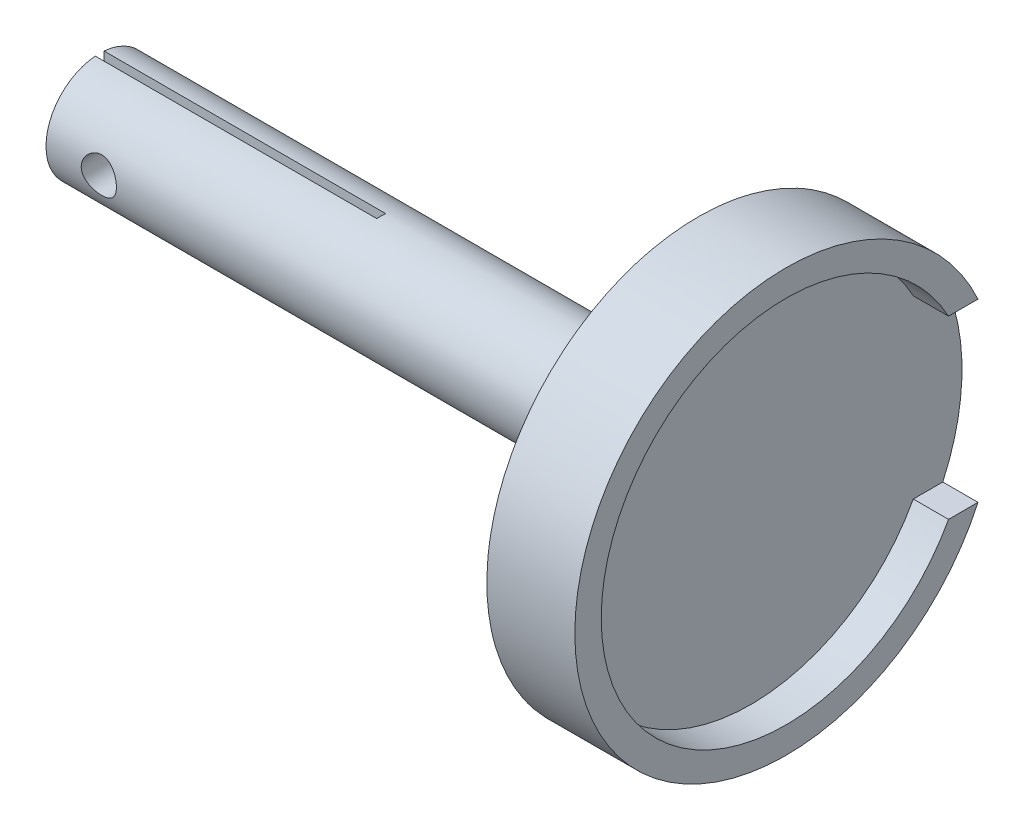
ISO-10303-21;
HEADER;
FILE_DESCRIPTION(('STEP AP214'),'2;1');
FILE_NAME('part.step','',(''),(''),'','','');
FILE_SCHEMA(('AUTOMOTIVE_DESIGN { 1 0 10303 214 1 1 1 1 }'));
ENDSEC;
DATA;
#1=APPLICATION_CONTEXT('core data for automotive mechanical design processes');
#2=APPLICATION_PROTOCOL_DEFINITION('international standard','automotive_design',2000,#1);
#3=PRODUCT_CONTEXT('',#1,'mechanical');
#4=PRODUCT('Part','Part','',(#3));
#5=PRODUCT_RELATED_PRODUCT_CATEGORY('part','',(#4));
#6=PRODUCT_DEFINITION_FORMATION('','',#4);
#7=PRODUCT_DEFINITION_CONTEXT('part definition',#1,'design');
#8=PRODUCT_DEFINITION('design','',#6,#7);
#9=PRODUCT_DEFINITION_SHAPE('','',#8);
#10=(LENGTH_UNIT() NAMED_UNIT(*) SI_UNIT(.MILLI.,.METRE.));
#11=(NAMED_UNIT(*) PLANE_ANGLE_UNIT() SI_UNIT($,.RADIAN.));
#12=(NAMED_UNIT(*) SI_UNIT($,.STERADIAN.) SOLID_ANGLE_UNIT());
#13=UNCERTAINTY_MEASURE_WITH_UNIT(LENGTH_MEASURE(1.E-05),#10,'distance_accuracy_value','');
#14=(GEOMETRIC_REPRESENTATION_CONTEXT(3) GLOBAL_UNCERTAINTY_ASSIGNED_CONTEXT((#13)) GLOBAL_UNIT_ASSIGNED_CONTEXT((#10,
#11,#12)) REPRESENTATION_CONTEXT('',''));
#15=CARTESIAN_POINT('',(0.,0.,0.));
#16=DIRECTION('',(0.,0.,1.));
#17=DIRECTION('',(1.,0.,0.));
#18=AXIS2_PLACEMENT_3D('',#15,#16,#17);
#19=CARTESIAN_POINT('',(34.,0.,0.));
#20=DIRECTION('',(-1.,0.,0.));
#21=DIRECTION('',(0.,0.,1.));
#22=AXIS2_PLACEMENT_3D('',#19,#20,#21);
#23=CYLINDRICAL_SURFACE('',#22,3.05);
#24=CARTESIAN_POINT('',(29.1114930704764,0.,-3.05));
#25=CARTESIAN_POINT('',(29.1114930704764,0.399244066002534,-3.05));
#26=CARTESIAN_POINT('',(29.1114930704764,0.798331047656877,-2.9706166636888));
#27=CARTESIAN_POINT('',(29.1114930704764,1.53603788977017,-2.66504848463005));
#28=CARTESIAN_POINT('',(29.1114930704764,1.87436749619847,-2.43898386903947));
#29=CARTESIAN_POINT('',(29.1114930704764,2.43898386903947,-1.87436749619847));
#30=CARTESIAN_POINT('',(29.1114930704764,2.66504848462992,-1.53603788977048));
#31=CARTESIAN_POINT('',(29.1114930704764,2.97061666368893,-0.798331047656558));
#32=CARTESIAN_POINT('',(29.1114930704764,3.05,-0.399244066002982));
#33=CARTESIAN_POINT('',(29.1114930704764,3.05,0.399244066002982));
#34=CARTESIAN_POINT('',(29.1114930704764,2.97061666368867,0.798331047657195));
#35=CARTESIAN_POINT('',(29.1114930704764,2.66504848463018,1.53603788976986));
#36=CARTESIAN_POINT('',(29.1114930704764,2.43898386903872,1.87436749619921));
#37=CARTESIAN_POINT('',(29.1114930704764,1.87436749619921,2.43898386903873));
#38=CARTESIAN_POINT('',(29.1114930704764,1.53603788977091,2.66504848462974));
#39=CARTESIAN_POINT('',(29.1114930704764,0.79833104765615,2.9706166636891));
#40=CARTESIAN_POINT('',(29.1114930704764,0.399244066002983,3.05));
#41=CARTESIAN_POINT('',(29.1114930704764,-0.399244066002982,3.05));
#42=CARTESIAN_POINT('',(29.1114930704764,-0.798331047656664,2.97061666368889));
#43=CARTESIAN_POINT('',(29.1114930704764,-1.53603788977037,2.66504848462996));
#44=CARTESIAN_POINT('',(29.1114930704764,-1.87436749619921,2.43898386903872));
#45=CARTESIAN_POINT('',(29.1114930704764,-2.43898386903873,1.87436749619921));
#46=CARTESIAN_POINT('',(29.1114930704764,-2.66504848462999,1.53603788977031));
#47=CARTESIAN_POINT('',(29.1114930704764,-2.97061666368886,0.798331047656749));
#48=CARTESIAN_POINT('',(29.1114930704764,-3.05,0.399244066002978));
#49=CARTESIAN_POINT('',(29.1114930704764,-3.05,-0.399244066002987));
#50=CARTESIAN_POINT('',(29.1114930704764,-2.97061666368895,-0.798331047656523));
#51=CARTESIAN_POINT('',(29.1114930704764,-2.66504848462991,-1.53603788977052));
#52=CARTESIAN_POINT('',(29.1114930704764,-2.43898386903814,-1.87436749619979));
#53=CARTESIAN_POINT('',(29.1114930704764,-1.87436749619981,-2.43898386903813));
#54=CARTESIAN_POINT('',(29.1114930704764,-1.53603788977021,-2.66504848463003));
#55=CARTESIAN_POINT('',(29.1114930704764,-0.798331047656848,-2.97061666368881));
#56=CARTESIAN_POINT('',(29.1114930704764,-0.399244066002535,-3.05));
#57=CARTESIAN_POINT('',(29.1114930704764,0.,-3.05));
#58=(BOUNDED_CURVE() B_SPLINE_CURVE(3,(#24,#25,#26,#27,#28,#29,#30,#31,#32,#33,#34,#35,#36,#37,
#38,#39,#40,#41,#42,#43,#44,#45,#46,#47,#48,#49,#50,#51,#52,#53,#54,#55,#56,#57),.UNSPECIFIED.,
.T.,.F.) B_SPLINE_CURVE_WITH_KNOTS((4,2,2,2,2,2,2,2,2,2,2,2,2,2,2,2,4),(0.,0.392699081698724,
0.785398163397448,1.17809724509617,1.5707963267949,1.96349540849362,2.35619449019234,
2.74889357189107,3.14159265358979,3.53429173528852,3.92699081698724,4.31968989868597,
4.71238898038469,5.10508806208341,5.49778714378214,5.89048622548086,6.28318530717959),
.UNSPECIFIED.) CURVE() GEOMETRIC_REPRESENTATION_ITEM() RATIONAL_B_SPLINE_CURVE((1.,1.,1.,1.,1.,
1.,1.,1.,1.,1.,1.,1.,1.,1.,1.,1.,1.,1.,1.,1.,1.,1.,1.,1.,1.,1.,1.,1.,1.,1.,1.,1.,1.,1.)) REPRESENTATION_ITEM(''));
#59=CARTESIAN_POINT('',(29.1114930704764,0.,-3.05));
#60=VERTEX_POINT('',#59);
#61=EDGE_CURVE('E12',#60,#60,#58,.F.);
#62=ORIENTED_EDGE('',*,*,#61,.T.);
#63=EDGE_LOOP('',(#62));
#64=FACE_BOUND('',#63,.T.);
#65=CARTESIAN_POINT('',(0.,0.,0.));
#66=DIRECTION('',(1.,0.,0.));
#67=DIRECTION('',(0.,0.,-1.));
#68=AXIS2_PLACEMENT_3D('',#65,#66,#67);
#69=CIRCLE('',#68,3.05);
#70=CARTESIAN_POINT('',(0.,3.03973683071413,0.25));
#71=VERTEX_POINT('',#70);
#72=CARTESIAN_POINT('',(0.,3.03973683071413,-0.25));
#73=VERTEX_POINT('',#72);
#74=EDGE_CURVE('E216',#71,#73,#69,.T.);
#75=ORIENTED_EDGE('',*,*,#74,.T.);
#76=DIRECTION('',(-1.,0.,0.));
#77=VECTOR('',#76,1.);
#78=CARTESIAN_POINT('',(34.,3.03973683071413,-0.25));
#79=LINE('',#78,#77);
#80=CARTESIAN_POINT('',(16.,3.03973683071413,-0.25));
#81=VERTEX_POINT('',#80);
#82=EDGE_CURVE('E213',#73,#81,#79,.F.);
#83=ORIENTED_EDGE('',*,*,#82,.T.);
#84=CARTESIAN_POINT('',(16.,0.,0.));
#85=DIRECTION('',(-1.,0.,0.));
#86=DIRECTION('',(0.,0.,1.));
#87=AXIS2_PLACEMENT_3D('',#84,#85,#86);
#88=CIRCLE('',#87,3.05);
#89=CARTESIAN_POINT('',(16.,3.03973683071413,0.25));
#90=VERTEX_POINT('',#89);
#91=EDGE_CURVE('E53',#90,#81,#88,.T.);
#92=ORIENTED_EDGE('',*,*,#91,.F.);
#93=DIRECTION('',(-1.,0.,0.));
#94=VECTOR('',#93,1.);
#95=CARTESIAN_POINT('',(34.,3.03973683071413,0.25));
#96=LINE('',#95,#94);
#97=EDGE_CURVE('E209',#90,#71,#96,.T.);
#98=ORIENTED_EDGE('',*,*,#97,.T.);
#99=EDGE_LOOP('',(#75,#83,#92,#98));
#100=FACE_BOUND('',#99,.T.);
#101=CARTESIAN_POINT('',(3.,-1.00513158464293,-2.87961985295858));
#102=CARTESIAN_POINT('',(2.94549597035119,-1.00513166724251,-2.87961982470852));
#103=CARTESIAN_POINT('',(2.89099207979804,-1.00066042307044,-2.88119219888025));
#104=CARTESIAN_POINT('',(2.78359607493865,-0.982951963020422,-2.88728090255156));
#105=CARTESIAN_POINT('',(2.73070427447741,-0.969713051493951,-2.89179780151342));
#106=CARTESIAN_POINT('',(2.62810571020994,-0.934982848309444,-2.90321156367945));
#107=CARTESIAN_POINT('',(2.57839302780224,-0.91350744532338,-2.91010384205867));
#108=CARTESIAN_POINT('',(2.48326108773233,-0.862968339079333,-2.92548814050529));
#109=CARTESIAN_POINT('',(2.43784273595442,-0.833903039583945,-2.93398049698169));
#110=CARTESIAN_POINT('',(2.35085341417011,-0.767820601515097,-2.95197588637567));
#111=CARTESIAN_POINT('',(2.30947043569096,-0.730562701336779,-2.96150375213242));
#112=CARTESIAN_POINT('',(2.23341236626205,-0.649667427895264,-2.98029435868337));
#113=CARTESIAN_POINT('',(2.19873833458106,-0.606029049131326,-2.98955705741423));
#114=CARTESIAN_POINT('',(2.13622423459713,-0.512228850606815,-3.00706703815949));
#115=CARTESIAN_POINT('',(2.10858254648439,-0.46192827790856,-3.0152821327917));
#116=CARTESIAN_POINT('',(2.06222701137103,-0.357076090745735,-3.02948683280831));
#117=CARTESIAN_POINT('',(2.04351085202479,-0.302525581581626,-3.0354770145141));
#118=CARTESIAN_POINT('',(2.01616822004823,-0.192668978472822,-3.04439024941703));
#119=CARTESIAN_POINT('',(2.00722339356719,-0.137450093074328,-3.04740973730578));
#120=CARTESIAN_POINT('',(1.99866853567068,-0.0262177795436076,-3.05039419763753));
#121=CARTESIAN_POINT('',(1.99905614721971,0.0297954443957818,-3.05035994133968));
#122=CARTESIAN_POINT('',(2.00895158532831,0.138746448748743,-3.04731157268238));
#123=CARTESIAN_POINT('',(2.0181091030853,0.191719795382586,-3.04441178117238));
#124=CARTESIAN_POINT('',(2.04470849241183,0.295334169345902,-3.03611273863335));
#125=CARTESIAN_POINT('',(2.06215090250623,0.345975044828057,-3.0307133251274));
#126=CARTESIAN_POINT('',(2.10502295472471,0.444229642311097,-3.01788791702512));
#127=CARTESIAN_POINT('',(2.13054923512903,0.491797883065166,-3.01043755325361));
#128=CARTESIAN_POINT('',(2.18878520216414,0.582080666824855,-2.99429265401132));
#129=CARTESIAN_POINT('',(2.22149682599593,0.624793896175931,-2.98559778323651));
#130=CARTESIAN_POINT('',(2.29492042106559,0.706206553560568,-2.96742173503027));
#131=CARTESIAN_POINT('',(2.33592831970621,0.744635503516695,-2.95792278088868));
#132=CARTESIAN_POINT('',(2.42388604705218,0.814158239872629,-2.93954803858875));
#133=CARTESIAN_POINT('',(2.47083673264953,0.845250966605064,-2.93067234058539));
#134=CARTESIAN_POINT('',(2.57019496809761,0.899587100731472,-2.91445728668923));
#135=CARTESIAN_POINT('',(2.6226682667742,0.922717549562088,-2.90714056012349));
#136=CARTESIAN_POINT('',(2.73106245365029,0.959725285965181,-2.89513562940463));
#137=CARTESIAN_POINT('',(2.78698196251789,0.973606249665906,-2.89044638110094));
#138=CARTESIAN_POINT('',(2.8980912894925,0.991181790951132,-2.88446557245529));
#139=CARTESIAN_POINT('',(2.95320812859812,0.995290827084138,-2.88303587940632));
#140=CARTESIAN_POINT('',(3.06335113831373,0.994377450223513,-2.88335121704284));
#141=CARTESIAN_POINT('',(3.1183773229611,0.989356617014337,-2.88509569848594));
#142=CARTESIAN_POINT('',(3.22490853255726,0.970699452695871,-2.89142406116211));
#143=CARTESIAN_POINT('',(3.27646986841007,0.957349224323589,-2.89591355650253));
#144=CARTESIAN_POINT('',(3.37661184906278,0.922753780108491,-2.9071212267378));
#145=CARTESIAN_POINT('',(3.42519197732271,0.901507200576422,-2.91383978656758));
#146=CARTESIAN_POINT('',(3.51964051188144,0.850981512795522,-2.92900059957563));
#147=CARTESIAN_POINT('',(3.56538034241094,0.82147637504844,-2.93748933184412));
#148=CARTESIAN_POINT('',(3.65141102142154,0.755528163955249,-2.95513798395867));
#149=CARTESIAN_POINT('',(3.69170032193489,0.719083126701394,-2.96429809334391));
#150=CARTESIAN_POINT('',(3.76759016629371,0.638307648648085,-2.98275944950205));
#151=CARTESIAN_POINT('',(3.80289186473326,0.593692728701855,-2.99204798006602));
#152=CARTESIAN_POINT('',(3.86552451989319,0.498943357427558,-3.00929740108202));
#153=CARTESIAN_POINT('',(3.89285580880323,0.448809136252187,-3.01725834685903));
#154=CARTESIAN_POINT('',(3.93851005240919,0.344730697326772,-3.03090622756889));
#155=CARTESIAN_POINT('',(3.95689648556554,0.290816529085555,-3.03660913153469));
#156=CARTESIAN_POINT('',(3.98427293661498,0.180440058420558,-3.04516012031907));
#157=CARTESIAN_POINT('',(3.99326620894833,0.123978645615967,-3.04800919388776));
#158=CARTESIAN_POINT('',(4.00131784746461,0.012867071453746,-3.05045616259236));
#159=CARTESIAN_POINT('',(4.00080859656403,-0.0417489902437638,-3.0501957477278));
#160=CARTESIAN_POINT('',(3.99093306184365,-0.150077298192969,-3.04678733205802));
#161=CARTESIAN_POINT('',(3.98156743496727,-0.203789611181667,-3.04363954543119));
#162=CARTESIAN_POINT('',(3.95452546718122,-0.308016029385854,-3.03485167149046));
#163=CARTESIAN_POINT('',(3.93697145480329,-0.358565187686155,-3.02924834042412));
#164=CARTESIAN_POINT('',(3.89416650390139,-0.456019917583154,-3.01611774506934));
#165=CARTESIAN_POINT('',(3.86891417571458,-0.502924829418172,-3.0085901334587));
#166=CARTESIAN_POINT('',(3.81036574394545,-0.593626842910554,-2.99204127377414));
#167=CARTESIAN_POINT('',(3.77680944120207,-0.637247763506862,-2.98297549951648));
#168=CARTESIAN_POINT('',(3.70305231878256,-0.718381219325374,-2.96448362711988));
#169=CARTESIAN_POINT('',(3.6628494034088,-0.755891820515388,-2.95505741605699));
#170=CARTESIAN_POINT('',(3.57513417399314,-0.825167588430484,-2.93648338957373));
#171=CARTESIAN_POINT('',(3.52740420815925,-0.856664383235488,-2.92735928904023));
#172=CARTESIAN_POINT('',(3.42704376739014,-0.911162174203269,-2.91085869793583));
#173=CARTESIAN_POINT('',(3.3744147963758,-0.934165766952142,-2.90348167348743));
#174=CARTESIAN_POINT('',(3.26879662402627,-0.969847554108903,-2.89175207849726));
#175=CARTESIAN_POINT('',(3.21599667065257,-0.983036788893566,-2.88725186694306));
#176=CARTESIAN_POINT('',(3.10879742106876,-1.00067736769108,-2.88118623688995));
#177=CARTESIAN_POINT('',(3.05439864125524,-1.00513150220308,-2.87961988115401));
#178=CARTESIAN_POINT('',(3.,-1.00513158464293,-2.87961985295858));
#179=B_SPLINE_CURVE_WITH_KNOTS('',3,(#101,#102,#103,#104,#105,#106,#107,#108,#109,#110,#111,
#112,#113,#114,#115,#116,#117,#118,#119,#120,#121,#122,#123,#124,#125,#126,#127,#128,#129,#130,
#131,#132,#133,#134,#135,#136,#137,#138,#139,#140,#141,#142,#143,#144,#145,#146,#147,#148,#149,
#150,#151,#152,#153,#154,#155,#156,#157,#158,#159,#160,#161,#162,#163,#164,#165,#166,#167,#168,
#169,#170,#171,#172,#173,#174,#175,#176,#177,#178),.UNSPECIFIED.,.T.,.F.,(4,2,2,2,2,2,2,2,2,2,2,
2,2,2,2,2,2,2,2,2,2,2,2,2,2,2,2,2,2,2,2,2,2,2,2,2,2,2,4),(0.,0.163310690589457,
0.326652974351479,0.489681733423415,0.65274480686089,0.821461499346943,0.990204808640642,
1.16328179458683,1.3363139169142,1.50352294747035,1.67068974753051,1.8314460938282,
1.99221289085197,2.15497912429985,2.31778929423739,2.48799543306749,2.65822614198248,
2.83078093219217,3.00326710101571,3.16829588124419,3.33329610847986,3.49291914449885,
3.65256976002136,3.8171087334384,3.98169433878188,4.153809868498,4.32591822378062,
4.49678669349977,4.66759594291103,4.83065279860946,4.99369756011431,5.15438094525258,
5.31509335337297,5.48167808397501,5.64831543978477,5.82120498353801,5.99404162674291,
6.15708863676273,6.32008355159314),.UNSPECIFIED.);
#180=CARTESIAN_POINT('',(3.,-1.00513158464293,-2.87961985295858));
#181=VERTEX_POINT('',#180);
#182=EDGE_CURVE('E147',#181,#181,#179,.T.);
#183=ORIENTED_EDGE('',*,*,#182,.F.);
#184=EDGE_LOOP('',(#183));
#185=FACE_BOUND('',#184,.T.);
#186=CARTESIAN_POINT('',(3.99998683333285,0.,3.05));
#187=CARTESIAN_POINT('',(3.99970658682409,0.0546261070997252,3.05000002875027));
#188=CARTESIAN_POINT('',(3.99493549231713,0.109229089941042,3.04851883907038));
#189=CARTESIAN_POINT('',(3.97659143335726,0.216783790506008,3.04276309519239));
#190=CARTESIAN_POINT('',(3.96301723104305,0.269735274904211,3.03848814814554));
#191=CARTESIAN_POINT('',(3.92757722855279,0.372422121069229,3.02761718205127));
#192=CARTESIAN_POINT('',(3.90572506609854,0.422162615950876,3.02102498189799));
#193=CARTESIAN_POINT('',(3.85440720691274,0.517276474473661,3.00620109622625));
#194=CARTESIAN_POINT('',(3.82494009169658,0.562649022306544,2.99796910531933));
#195=CARTESIAN_POINT('',(3.75818595317107,0.649263978655809,2.98043107646347));
#196=CARTESIAN_POINT('',(3.72068891915631,0.690339449934592,2.97110004107037));
#197=CARTESIAN_POINT('',(3.63939481902737,0.765743937867106,2.95256615218151));
#198=CARTESIAN_POINT('',(3.59559646177916,0.800071568476534,2.94336332538044));
#199=CARTESIAN_POINT('',(3.5014940378631,0.861907651834772,2.92586370761712));
#200=CARTESIAN_POINT('',(3.45104636760006,0.889207216441934,2.91759804731603));
#201=CARTESIAN_POINT('',(3.34596075613364,0.934863184311807,2.90329253538347));
#202=CARTESIAN_POINT('',(3.29132406564123,0.953222244988242,2.8972520224947));
#203=CARTESIAN_POINT('',(3.18131646941955,0.979865960174033,2.88834821244282));
#204=CARTESIAN_POINT('',(3.12602957089306,0.988463645726521,2.88538646700128));
#205=CARTESIAN_POINT('',(3.01472504115815,0.996314071857177,2.88268577689047));
#206=CARTESIAN_POINT('',(2.95870762447796,0.995569496837934,2.88294590644824));
#207=CARTESIAN_POINT('',(2.85009081862807,0.985008250476519,2.88656985485702));
#208=CARTESIAN_POINT('',(2.79744810411869,0.975583535730331,2.88979956994054));
#209=CARTESIAN_POINT('',(2.69453466867137,0.948557207584742,2.89878250222305));
#210=CARTESIAN_POINT('',(2.64426423227978,0.930954616010311,2.90453602129557));
#211=CARTESIAN_POINT('',(2.54655338204563,0.887777749803766,2.91802463755303));
#212=CARTESIAN_POINT('',(2.49917382252849,0.862075957334719,2.92579105281901));
#213=CARTESIAN_POINT('',(2.40927029415156,0.803520579478015,2.94241039018524));
#214=CARTESIAN_POINT('',(2.366747691946,0.770664988670392,2.95126361664645));
#215=CARTESIAN_POINT('',(2.28554292118282,0.696802003320937,2.96959305651458));
#216=CARTESIAN_POINT('',(2.24715718424968,0.655470301215035,2.97907834727077));
#217=CARTESIAN_POINT('',(2.17779022590932,0.566828633104411,2.99720689649346));
#218=CARTESIAN_POINT('',(2.14680958587103,0.519518198159061,3.00585008881587));
#219=CARTESIAN_POINT('',(2.09295096540414,0.419722322970331,3.02140694438405));
#220=CARTESIAN_POINT('',(2.07013855627978,0.367199145261479,3.02830648598034));
#221=CARTESIAN_POINT('',(2.03376186345821,0.258781650849247,3.03948949339313));
#222=CARTESIAN_POINT('',(2.0201944584212,0.202888478882726,3.04377384211186));
#223=CARTESIAN_POINT('',(2.00319955430448,0.0918641436700084,3.04910122653182));
#224=CARTESIAN_POINT('',(1.9993664485332,0.0368011828012197,3.05027401268191));
#225=CARTESIAN_POINT('',(2.00080409649327,-0.0731823790737107,3.04961749528811));
#226=CARTESIAN_POINT('',(2.00607344713411,-0.12810300071375,3.04778865442967));
#227=CARTESIAN_POINT('',(2.02524625150666,-0.234722113283185,3.04141160727562));
#228=CARTESIAN_POINT('',(2.03891591578339,-0.286467466419549,3.03693715458451));
#229=CARTESIAN_POINT('',(2.07421426698491,-0.386911298465991,3.02578179321074));
#230=CARTESIAN_POINT('',(2.0958440061491,-0.435609373561261,3.01910059283087));
#231=CARTESIAN_POINT('',(2.14710048461839,-0.530037492504769,3.00398232663019));
#232=CARTESIAN_POINT('',(2.17692737385713,-0.575651899424344,2.99550272323986));
#233=CARTESIAN_POINT('',(2.24348848925348,-0.661360614879665,2.97775434820194));
#234=CARTESIAN_POINT('',(2.2802247805645,-0.701453266793915,2.96848534106362));
#235=CARTESIAN_POINT('',(2.36146412032668,-0.776800535086621,2.94968740271156));
#236=CARTESIAN_POINT('',(2.4062364538998,-0.811767104780348,2.94016481770318));
#237=CARTESIAN_POINT('',(2.50122923582964,-0.873718073940646,2.92235509377284));
#238=CARTESIAN_POINT('',(2.55144962229901,-0.900702564066945,2.91406794081949));
#239=CARTESIAN_POINT('',(2.65581815091703,-0.945745693963259,2.89976287980141));
#240=CARTESIAN_POINT('',(2.70994965170562,-0.963839860387347,2.89373596285648));
#241=CARTESIAN_POINT('',(2.82073342632621,-0.990579071564432,2.88469346546522));
#242=CARTESIAN_POINT('',(2.8773845907813,-0.999228232803899,2.88167657318711));
#243=CARTESIAN_POINT('',(2.98852365029662,-1.00653677396279,2.87913126047586));
#244=CARTESIAN_POINT('',(3.04297640203924,-1.00567835937074,2.87943444320724));
#245=CARTESIAN_POINT('',(3.15091678066527,-0.995163980344742,2.88308496685565));
#246=CARTESIAN_POINT('',(3.20440445468435,-0.985508446766351,2.88643215868657));
#247=CARTESIAN_POINT('',(3.30800940202035,-0.957998838088086,2.89567641927919));
#248=CARTESIAN_POINT('',(3.3581682467579,-0.940285467969893,2.90152962908213));
#249=CARTESIAN_POINT('',(3.45484428202498,-0.897273689576541,2.91511685692755));
#250=CARTESIAN_POINT('',(3.50136066501965,-0.871973605295084,2.92285129048605));
#251=CARTESIAN_POINT('',(3.59161881622019,-0.813222724721702,2.93975178247771));
#252=CARTESIAN_POINT('',(3.63515220701176,-0.779465542333768,2.94896544337871));
#253=CARTESIAN_POINT('',(3.71609030301622,-0.705295399000408,2.96757788410296));
#254=CARTESIAN_POINT('',(3.75349329405162,-0.664880582765278,2.97697671488308));
#255=CARTESIAN_POINT('',(3.82250058460104,-0.576742545743023,2.99532388366516));
#256=CARTESIAN_POINT('',(3.85383870115957,-0.528804026964685,3.00424262934465));
#257=CARTESIAN_POINT('',(3.90797102540196,-0.428045899467075,3.02024392324674));
#258=CARTESIAN_POINT('',(3.93076780375818,-0.375227765333011,3.02732702374222));
#259=CARTESIAN_POINT('',(3.96600158706643,-0.269288036834659,3.03852897521557));
#260=CARTESIAN_POINT('',(3.97895133522653,-0.216352349016057,3.04279274781204));
#261=CARTESIAN_POINT('',(3.99608254056136,-0.108936518172093,3.04852789343961));
#262=CARTESIAN_POINT('',(4.00026621108954,-0.0544567685299346,3.04999997133886));
#263=CARTESIAN_POINT('',(3.99998683333285,0.,3.05));
#264=B_SPLINE_CURVE_WITH_KNOTS('',3,(#186,#187,#188,#189,#190,#191,#192,#193,#194,#195,#196,
#197,#198,#199,#200,#201,#202,#203,#204,#205,#206,#207,#208,#209,#210,#211,#212,#213,#214,#215,
#216,#217,#218,#219,#220,#221,#222,#223,#224,#225,#226,#227,#228,#229,#230,#231,#232,#233,#234,
#235,#236,#237,#238,#239,#240,#241,#242,#243,#244,#245,#246,#247,#248,#249,#250,#251,#252,#253,
#254,#255,#256,#257,#258,#259,#260,#261,#262,#263),.UNSPECIFIED.,.T.,.F.,(4,2,2,2,2,2,2,2,2,2,2,
2,2,2,2,2,2,2,2,2,2,2,2,2,2,2,2,2,2,2,2,2,2,2,2,2,2,2,4),(0.,0.163680029514569,
0.327383080117384,0.490817598958576,0.654282583736583,0.822703834487743,0.991159643841435,
1.1641588161778,1.3371065360003,1.50433588277316,1.67151717901211,1.83150090092063,
1.99150376378614,2.15416350738022,2.31686890812407,2.48767140100725,2.65848729907197,
2.83064522201695,3.00274499139273,3.16754647430986,3.33232255630751,3.4927083132177,
3.65311527908275,3.81785320976481,3.9826404574939,4.15463009303312,4.32661777505479,
4.49791247055746,4.6691324795927,4.83171002784084,4.99427961397379,5.15411337124044,
5.3139824639599,5.48079791580237,5.64765993316379,5.82070415429958,5.99369625268804,
6.15691009614196,6.32008272464311),.UNSPECIFIED.);
#265=CARTESIAN_POINT('',(3.99998683333285,0.,3.05));
#266=VERTEX_POINT('',#265);
#267=EDGE_CURVE('E154',#266,#266,#264,.T.);
#268=ORIENTED_EDGE('',*,*,#267,.F.);
#269=EDGE_LOOP('',(#268));
#270=FACE_BOUND('',#269,.T.);
#271=ADVANCED_FACE('F38',(#64,#100,#185,#270),#23,.T.);
#272=CARTESIAN_POINT('',(0.,0.,0.));
#273=DIRECTION('',(1.,0.,0.));
#274=DIRECTION('',(0.,0.,-1.));
#275=AXIS2_PLACEMENT_3D('',#272,#273,#274);
#276=PLANE('',#275);
#277=DIRECTION('',(0.,0.,1.));
#278=VECTOR('',#277,1.);
#279=CARTESIAN_POINT('',(0.,-2.59236932889197,-0.25));
#280=LINE('',#279,#278);
#281=CARTESIAN_POINT('',(0.,-2.59236932889197,-0.25));
#282=VERTEX_POINT('',#281);
#283=CARTESIAN_POINT('',(0.,-2.59236932889197,0.25));
#284=VERTEX_POINT('',#283);
#285=EDGE_CURVE('E194',#282,#284,#280,.T.);
#286=ORIENTED_EDGE('',*,*,#285,.F.);
#287=DIRECTION('',(0.,1.,0.));
#288=VECTOR('',#287,1.);
#289=CARTESIAN_POINT('',(0.,0.,-0.25));
#290=LINE('',#289,#288);
#291=EDGE_CURVE('E196',#282,#73,#290,.T.);
#292=ORIENTED_EDGE('',*,*,#291,.T.);
#293=ORIENTED_EDGE('',*,*,#74,.F.);
#294=DIRECTION('',(0.,1.,0.));
#295=VECTOR('',#294,1.);
#296=CARTESIAN_POINT('',(0.,3.86196678721204,0.25));
#297=LINE('',#296,#295);
#298=EDGE_CURVE('E198',#284,#71,#297,.T.);
#299=ORIENTED_EDGE('',*,*,#298,.F.);
#300=EDGE_LOOP('',(#286,#292,#293,#299));
#301=FACE_BOUND('',#300,.T.);
#302=ADVANCED_FACE('F175',(#301),#276,.F.);
#303=CARTESIAN_POINT('',(16.,0.,0.));
#304=DIRECTION('',(-1.,0.,0.));
#305=DIRECTION('',(0.,0.,1.));
#306=AXIS2_PLACEMENT_3D('',#303,#304,#305);
#307=PLANE('',#306);
#308=ORIENTED_EDGE('',*,*,#91,.T.);
#309=DIRECTION('',(0.,-1.,0.));
#310=VECTOR('',#309,1.);
#311=CARTESIAN_POINT('',(16.,3.86196678721204,-0.25));
#312=LINE('',#311,#310);
#313=CARTESIAN_POINT('',(16.,-2.59236932889197,-0.25));
#314=VERTEX_POINT('',#313);
#315=EDGE_CURVE('E200',#81,#314,#312,.T.);
#316=ORIENTED_EDGE('',*,*,#315,.T.);
#317=DIRECTION('',(0.,0.,1.));
#318=VECTOR('',#317,1.);
#319=CARTESIAN_POINT('',(16.,-2.59236932889197,-0.25));
#320=LINE('',#319,#318);
#321=CARTESIAN_POINT('',(16.,-2.59236932889197,0.25));
#322=VERTEX_POINT('',#321);
#323=EDGE_CURVE('E273',#314,#322,#320,.T.);
#324=ORIENTED_EDGE('',*,*,#323,.T.);
#325=DIRECTION('',(0.,1.,0.));
#326=VECTOR('',#325,1.);
#327=CARTESIAN_POINT('',(16.,3.86196678721204,0.25));
#328=LINE('',#327,#326);
#329=EDGE_CURVE('E204',#322,#90,#328,.T.);
#330=ORIENTED_EDGE('',*,*,#329,.T.);
#331=EDGE_LOOP('',(#308,#316,#324,#330));
#332=FACE_BOUND('',#331,.T.);
#333=ADVANCED_FACE('F170',(#332),#307,.T.);
#334=CARTESIAN_POINT('',(16.,3.86196678721204,-0.25));
#335=DIRECTION('',(0.,0.,-1.));
#336=DIRECTION('',(-1.,0.,0.));
#337=AXIS2_PLACEMENT_3D('',#334,#335,#336);
#338=PLANE('',#337);
#339=CARTESIAN_POINT('',(3.,-0.00513158464293418,-0.25));
#340=DIRECTION('',(0.,0.,-1.));
#341=DIRECTION('',(-1.,0.,0.));
#342=AXIS2_PLACEMENT_3D('',#339,#340,#341);
#343=CIRCLE('',#342,1.);
#344=CARTESIAN_POINT('',(2.,-0.00513158464293418,-0.25));
#345=VERTEX_POINT('',#344);
#346=EDGE_CURVE('E138',#345,#345,#343,.F.);
#347=ORIENTED_EDGE('',*,*,#346,.F.);
#348=EDGE_LOOP('',(#347));
#349=FACE_BOUND('',#348,.T.);
#350=ORIENTED_EDGE('',*,*,#291,.F.);
#351=DIRECTION('',(-1.,0.,0.));
#352=VECTOR('',#351,1.);
#353=CARTESIAN_POINT('',(16.,-2.59236932889197,-0.25));
#354=LINE('',#353,#352);
#355=EDGE_CURVE('E68',#314,#282,#354,.T.);
#356=ORIENTED_EDGE('',*,*,#355,.F.);
#357=ORIENTED_EDGE('',*,*,#315,.F.);
#358=ORIENTED_EDGE('',*,*,#82,.F.);
#359=EDGE_LOOP('',(#350,#356,#357,#358));
#360=FACE_BOUND('',#359,.T.);
#361=ADVANCED_FACE('F174',(#349,#360),#338,.F.);
#362=CARTESIAN_POINT('',(16.,3.86196678721204,0.25));
#363=DIRECTION('',(0.,0.,1.));
#364=DIRECTION('',(1.,0.,0.));
#365=AXIS2_PLACEMENT_3D('',#362,#363,#364);
#366=PLANE('',#365);
#367=CARTESIAN_POINT('',(3.,-0.00513158464293412,0.25));
#368=DIRECTION('',(0.,0.,1.));
#369=DIRECTION('',(1.,0.,0.));
#370=AXIS2_PLACEMENT_3D('',#367,#368,#369);
#371=CIRCLE('',#370,1.);
#372=CARTESIAN_POINT('',(4.,-0.00513158464293412,0.25));
#373=VERTEX_POINT('',#372);
#374=EDGE_CURVE('E134',#373,#373,#371,.F.);
#375=ORIENTED_EDGE('',*,*,#374,.F.);
#376=EDGE_LOOP('',(#375));
#377=FACE_BOUND('',#376,.T.);
#378=ORIENTED_EDGE('',*,*,#329,.F.);
#379=DIRECTION('',(-1.,0.,0.));
#380=VECTOR('',#379,1.);
#381=CARTESIAN_POINT('',(16.,-2.59236932889197,0.25));
#382=LINE('',#381,#380);
#383=EDGE_CURVE('E207',#322,#284,#382,.T.);
#384=ORIENTED_EDGE('',*,*,#383,.T.);
#385=ORIENTED_EDGE('',*,*,#298,.T.);
#386=ORIENTED_EDGE('',*,*,#97,.F.);
#387=EDGE_LOOP('',(#378,#384,#385,#386));
#388=FACE_BOUND('',#387,.T.);
#389=ADVANCED_FACE('F177',(#377,#388),#366,.F.);
#390=CARTESIAN_POINT('',(16.,-2.59236932889197,-0.25));
#391=DIRECTION('',(0.,-1.,0.));
#392=DIRECTION('',(0.,0.,-1.));
#393=AXIS2_PLACEMENT_3D('',#390,#391,#392);
#394=PLANE('',#393);
#395=ORIENTED_EDGE('',*,*,#285,.T.);
#396=ORIENTED_EDGE('',*,*,#383,.F.);
#397=ORIENTED_EDGE('',*,*,#323,.F.);
#398=ORIENTED_EDGE('',*,*,#355,.T.);
#399=EDGE_LOOP('',(#395,#396,#397,#398));
#400=FACE_BOUND('',#399,.T.);
#401=ADVANCED_FACE('F166',(#400),#394,.F.);
#402=CARTESIAN_POINT('',(3.,-0.00513158464293532,-9.75));
#403=DIRECTION('',(0.,0.,1.));
#404=DIRECTION('',(0.,-1.,0.));
#405=AXIS2_PLACEMENT_3D('',#402,#403,#404);
#406=CYLINDRICAL_SURFACE('',#405,1.);
#407=ORIENTED_EDGE('',*,*,#374,.T.);
#408=EDGE_LOOP('',(#407));
#409=FACE_BOUND('',#408,.T.);
#410=ORIENTED_EDGE('',*,*,#267,.T.);
#411=EDGE_LOOP('',(#410));
#412=FACE_BOUND('',#411,.T.);
#413=ADVANCED_FACE('F161',(#409,#412),#406,.F.);
#414=ORIENTED_EDGE('',*,*,#346,.T.);
#415=EDGE_LOOP('',(#414));
#416=FACE_BOUND('',#415,.T.);
#417=ORIENTED_EDGE('',*,*,#182,.T.);
#418=EDGE_LOOP('',(#417));
#419=FACE_BOUND('',#418,.T.);
#420=ADVANCED_FACE('F165',(#416,#419),#406,.F.);
#421=CARTESIAN_POINT('',(39.,0.,0.));
#422=DIRECTION('',(-1.,0.,0.));
#423=DIRECTION('',(0.,0.,1.));
#424=AXIS2_PLACEMENT_3D('',#421,#422,#423);
#425=CYLINDRICAL_SURFACE('',#424,12.);
#426=CARTESIAN_POINT('',(37.,0.,0.));
#427=DIRECTION('',(-1.,0.,0.));
#428=DIRECTION('',(0.,0.,1.));
#429=AXIS2_PLACEMENT_3D('',#426,#427,#428);
#430=CIRCLE('',#429,12.);
#431=CARTESIAN_POINT('',(37.,5.,-10.9087121146357));
#432=VERTEX_POINT('',#431);
#433=CARTESIAN_POINT('',(37.,-5.,-10.9087121146357));
#434=VERTEX_POINT('',#433);
#435=EDGE_CURVE('E383',#432,#434,#430,.T.);
#436=ORIENTED_EDGE('',*,*,#435,.T.);
#437=DIRECTION('',(-1.,0.,0.));
#438=VECTOR('',#437,1.);
#439=CARTESIAN_POINT('',(39.,-5.,-10.9087121146357));
#440=LINE('',#439,#438);
#441=CARTESIAN_POINT('',(39.,-5.,-10.9087121146357));
#442=VERTEX_POINT('',#441);
#443=EDGE_CURVE('E133',#434,#442,#440,.F.);
#444=ORIENTED_EDGE('',*,*,#443,.T.);
#445=CARTESIAN_POINT('',(39.,0.,0.));
#446=DIRECTION('',(1.,0.,0.));
#447=DIRECTION('',(0.,0.,-1.));
#448=AXIS2_PLACEMENT_3D('',#445,#446,#447);
#449=CIRCLE('',#448,12.);
#450=CARTESIAN_POINT('',(39.,5.,-10.9087121146357));
#451=VERTEX_POINT('',#450);
#452=EDGE_CURVE('E126',#451,#442,#449,.T.);
#453=ORIENTED_EDGE('',*,*,#452,.F.);
#454=DIRECTION('',(-1.,0.,0.));
#455=VECTOR('',#454,1.);
#456=CARTESIAN_POINT('',(39.,5.,-10.9087121146357));
#457=LINE('',#456,#455);
#458=EDGE_CURVE('E111',#451,#432,#457,.T.);
#459=ORIENTED_EDGE('',*,*,#458,.T.);
#460=EDGE_LOOP('',(#436,#444,#453,#459));
#461=FACE_BOUND('',#460,.T.);
#462=CARTESIAN_POINT('',(34.,0.,-12.));
#463=CARTESIAN_POINT('',(34.,-1.57079632525588,-12.));
#464=CARTESIAN_POINT('',(34.,-3.14097461373017,-11.687672119433));
#465=CARTESIAN_POINT('',(34.,-6.04342776303202,-10.4854366608379));
#466=CARTESIAN_POINT('',(34.,-7.37456064078693,-9.59600210769022));
#467=CARTESIAN_POINT('',(34.,-9.59600210769027,-7.37456064078688));
#468=CARTESIAN_POINT('',(34.,-10.4854366608379,-6.04342776303051));
#469=CARTESIAN_POINT('',(34.,-11.687672119433,-3.14097461373161));
#470=CARTESIAN_POINT('',(34.,-12.,-1.57079632525766));
#471=CARTESIAN_POINT('',(34.,-12.,1.57079632525762));
#472=CARTESIAN_POINT('',(34.,-11.687672119433,3.14097461373239));
#473=CARTESIAN_POINT('',(34.,-10.4854366608379,6.0434277630298));
#474=CARTESIAN_POINT('',(34.,-9.59600210769122,7.3745606407874));
#475=CARTESIAN_POINT('',(34.,-7.37456064078593,9.59600210768973));
#476=CARTESIAN_POINT('',(34.,-6.04342776303099,10.4854366608399));
#477=CARTESIAN_POINT('',(34.,-3.14097461373114,11.687672119431));
#478=CARTESIAN_POINT('',(34.,-1.57079632525763,12.));
#479=CARTESIAN_POINT('',(34.,1.57079632525764,12.));
#480=CARTESIAN_POINT('',(34.,3.14097461373043,11.687672119431));
#481=CARTESIAN_POINT('',(34.,6.04342776303176,10.4854366608399));
#482=CARTESIAN_POINT('',(34.,7.3745606407874,9.59600210769122));
#483=CARTESIAN_POINT('',(34.,9.59600210768973,7.37456064078593));
#484=CARTESIAN_POINT('',(34.,10.4854366608399,6.04342776303101));
#485=CARTESIAN_POINT('',(34.,11.687672119431,3.14097461373116));
#486=CARTESIAN_POINT('',(34.,12.,1.57079632525764));
#487=CARTESIAN_POINT('',(34.,12.,-1.57079632525764));
#488=CARTESIAN_POINT('',(34.,11.6876721194325,-3.14097461373189));
#489=CARTESIAN_POINT('',(34.,10.4854366608384,-6.04342776303026));
#490=CARTESIAN_POINT('',(34.,9.5960021076927,-7.37456064078593));
#491=CARTESIAN_POINT('',(34.,7.37456064078444,-9.59600210769122));
#492=CARTESIAN_POINT('',(34.,6.043427763031,-10.4854366608399));
#493=CARTESIAN_POINT('',(34.,3.14097461373115,-11.687672119431));
#494=CARTESIAN_POINT('',(34.,1.57079632525587,-12.));
#495=CARTESIAN_POINT('',(34.,0.,-12.));
#496=(BOUNDED_CURVE() B_SPLINE_CURVE(3,(#462,#463,#464,#465,#466,#467,#468,#469,#470,#471,#472,
#473,#474,#475,#476,#477,#478,#479,#480,#481,#482,#483,#484,#485,#486,#487,#488,#489,#490,#491,
#492,#493,#494,#495),.UNSPECIFIED.,.T.,.F.) B_SPLINE_CURVE_WITH_KNOTS((4,2,2,2,2,2,2,2,2,2,2,2,
2,2,2,2,4),(0.,0.392699081698725,0.785398163397448,1.17809724509617,1.5707963267949,
1.96349540849362,2.35619449019234,2.74889357189107,3.14159265358979,3.53429173528852,
3.92699081698724,4.31968989868597,4.71238898038469,5.10508806208341,5.49778714378214,
5.89048622548086,6.28318530717959),
.UNSPECIFIED.) CURVE() GEOMETRIC_REPRESENTATION_ITEM() RATIONAL_B_SPLINE_CURVE((1.,1.,1.,1.,1.,
1.,1.,1.,1.,1.,1.,1.,1.,1.,1.,1.,1.,1.,1.,1.,1.,1.,1.,1.,1.,1.,1.,1.,1.,1.,1.,1.,1.,1.)) REPRESENTATION_ITEM(''));
#497=CARTESIAN_POINT('',(34.,0.,-12.));
#498=VERTEX_POINT('',#497);
#499=EDGE_CURVE('E135',#498,#498,#496,.F.);
#500=ORIENTED_EDGE('',*,*,#499,.T.);
#501=EDGE_LOOP('',(#500));
#502=FACE_BOUND('',#501,.T.);
#503=ADVANCED_FACE('F131',(#461,#502),#425,.T.);
#504=CARTESIAN_POINT('',(39.,0.,0.));
#505=DIRECTION('',(1.,0.,0.));
#506=DIRECTION('',(0.,0.,-1.));
#507=AXIS2_PLACEMENT_3D('',#504,#505,#506);
#508=PLANE('',#507);
#509=DIRECTION('',(0.,0.,1.));
#510=VECTOR('',#509,1.);
#511=CARTESIAN_POINT('',(39.,-5.,-13.));
#512=LINE('',#511,#510);
#513=CARTESIAN_POINT('',(39.,-5.,-9.23309265630969));
#514=VERTEX_POINT('',#513);
#515=EDGE_CURVE('E379',#442,#514,#512,.T.);
#516=ORIENTED_EDGE('',*,*,#515,.T.);
#517=CARTESIAN_POINT('',(39.,0.,0.));
#518=DIRECTION('',(1.,0.,0.));
#519=DIRECTION('',(0.,0.,-1.));
#520=AXIS2_PLACEMENT_3D('',#517,#518,#519);
#521=CIRCLE('',#520,10.5);
#522=CARTESIAN_POINT('',(39.,5.,-9.23309265630969));
#523=VERTEX_POINT('',#522);
#524=EDGE_CURVE('E128',#523,#514,#521,.T.);
#525=ORIENTED_EDGE('',*,*,#524,.F.);
#526=DIRECTION('',(0.,0.,1.));
#527=VECTOR('',#526,1.);
#528=CARTESIAN_POINT('',(39.,5.,-13.));
#529=LINE('',#528,#527);
#530=EDGE_CURVE('E60',#451,#523,#529,.T.);
#531=ORIENTED_EDGE('',*,*,#530,.F.);
#532=ORIENTED_EDGE('',*,*,#452,.T.);
#533=EDGE_LOOP('',(#516,#525,#531,#532));
#534=FACE_BOUND('',#533,.T.);
#535=ADVANCED_FACE('F125',(#534),#508,.T.);
#536=CARTESIAN_POINT('',(34.,0.,-12.));
#537=CARTESIAN_POINT('',(34.,1.57079632525587,-12.));
#538=CARTESIAN_POINT('',(34.,3.14097461373115,-11.687672119431));
#539=CARTESIAN_POINT('',(34.,6.043427763031,-10.4854366608399));
#540=CARTESIAN_POINT('',(34.,7.37456064078444,-9.59600210769122));
#541=CARTESIAN_POINT('',(34.,9.5960021076927,-7.37456064078593));
#542=CARTESIAN_POINT('',(34.,10.4854366608384,-6.04342776303026));
#543=CARTESIAN_POINT('',(34.,11.6876721194325,-3.14097461373189));
#544=CARTESIAN_POINT('',(34.,12.,-1.57079632525764));
#545=CARTESIAN_POINT('',(34.,12.,1.57079632525764));
#546=CARTESIAN_POINT('',(34.,11.687672119431,3.14097461373116));
#547=CARTESIAN_POINT('',(34.,10.4854366608399,6.04342776303101));
#548=CARTESIAN_POINT('',(34.,9.59600210768973,7.37456064078593));
#549=CARTESIAN_POINT('',(34.,7.3745606407874,9.59600210769122));
#550=CARTESIAN_POINT('',(34.,6.04342776303176,10.4854366608399));
#551=CARTESIAN_POINT('',(34.,3.14097461373043,11.687672119431));
#552=CARTESIAN_POINT('',(34.,1.57079632525764,12.));
#553=CARTESIAN_POINT('',(34.,-1.57079632525763,12.));
#554=CARTESIAN_POINT('',(34.,-3.14097461373114,11.687672119431));
#555=CARTESIAN_POINT('',(34.,-6.04342776303099,10.4854366608399));
#556=CARTESIAN_POINT('',(34.,-7.37456064078593,9.59600210768973));
#557=CARTESIAN_POINT('',(34.,-9.59600210769122,7.3745606407874));
#558=CARTESIAN_POINT('',(34.,-10.4854366608379,6.0434277630298));
#559=CARTESIAN_POINT('',(34.,-11.687672119433,3.14097461373239));
#560=CARTESIAN_POINT('',(34.,-12.,1.57079632525762));
#561=CARTESIAN_POINT('',(34.,-12.,-1.57079632525766));
#562=CARTESIAN_POINT('',(34.,-11.687672119433,-3.14097461373161));
#563=CARTESIAN_POINT('',(34.,-10.4854366608379,-6.04342776303051));
#564=CARTESIAN_POINT('',(34.,-9.59600210769027,-7.37456064078688));
#565=CARTESIAN_POINT('',(34.,-7.37456064078693,-9.59600210769022));
#566=CARTESIAN_POINT('',(34.,-6.04342776303202,-10.4854366608379));
#567=CARTESIAN_POINT('',(34.,-3.14097461373017,-11.687672119433));
#568=CARTESIAN_POINT('',(34.,-1.57079632525588,-12.));
#569=CARTESIAN_POINT('',(34.,0.,-12.));
#570=CARTESIAN_POINT('',(32.0776339001905,0.,-3.05));
#571=CARTESIAN_POINT('',(32.0776339001905,0.399244066002534,-3.05));
#572=CARTESIAN_POINT('',(32.0776339001905,0.798331047656433,-2.97061666368803));
#573=CARTESIAN_POINT('',(32.0776339001905,1.53603788977061,-2.66504848463081));
#574=CARTESIAN_POINT('',(32.0776339001905,1.87436749619996,-2.43898386904095));
#575=CARTESIAN_POINT('',(32.0776339001905,2.43898386903799,-1.87436749619699));
#576=CARTESIAN_POINT('',(32.0776339001905,2.66504848462933,-1.53603788977061));
#577=CARTESIAN_POINT('',(32.0776339001905,2.97061666368952,-0.798331047656431));
#578=CARTESIAN_POINT('',(32.0776339001905,3.05,-0.399244066002982));
#579=CARTESIAN_POINT('',(32.0776339001905,3.05,0.399244066002982));
#580=CARTESIAN_POINT('',(32.0776339001846,2.97061666368952,0.798331047657176));
#581=CARTESIAN_POINT('',(32.0776339001964,2.66504848462933,1.53603788976987));
#582=CARTESIAN_POINT('',(32.0776339001905,2.43898386903947,1.87436749619921));
#583=CARTESIAN_POINT('',(32.0776339001905,1.87436749619847,2.43898386903873));
#584=CARTESIAN_POINT('',(32.0776339002023,1.53603788976988,2.66504848462785));
#585=CARTESIAN_POINT('',(32.0776339001786,0.798331047657177,2.970616663691));
#586=CARTESIAN_POINT('',(32.0776339001905,0.399244066002983,3.05));
#587=CARTESIAN_POINT('',(32.0776339001905,-0.399244066002982,3.05));
#588=CARTESIAN_POINT('',(32.0776339001846,-0.798331047657169,2.97061666368952));
#589=CARTESIAN_POINT('',(32.0776339001964,-1.53603788976987,2.66504848462933));
#590=CARTESIAN_POINT('',(32.0776339001905,-1.87436749619921,2.43898386903947));
#591=CARTESIAN_POINT('',(32.0776339001905,-2.43898386903873,1.87436749619847));
#592=CARTESIAN_POINT('',(32.0776339001846,-2.66504848462696,1.53603788976905));
#593=CARTESIAN_POINT('',(32.0776339001964,-2.97061666369188,0.798331047658002));
#594=CARTESIAN_POINT('',(32.0776339001964,-3.04999999999852,0.399244066002978));
#595=CARTESIAN_POINT('',(32.0776339001846,-3.05000000000148,-0.399244066002988));
#596=CARTESIAN_POINT('',(32.0776339001905,-2.97061666368744,-0.798331047655031));
#597=CARTESIAN_POINT('',(32.0776339001905,-2.66504848463141,-1.53603788977201));
#598=CARTESIAN_POINT('',(32.0776339001905,-2.43898386903666,-1.87436749619831));
#599=CARTESIAN_POINT('',(32.0776339001905,-1.87436749620129,-2.43898386903961));
#600=CARTESIAN_POINT('',(32.0776339001905,-1.53603788976979,-2.66504848462844));
#601=CARTESIAN_POINT('',(32.0776339001905,-0.798331047657261,-2.9706166636904));
#602=CARTESIAN_POINT('',(32.0776339001905,-0.399244066002535,-3.05));
#603=CARTESIAN_POINT('',(32.0776339001905,0.,-3.05));
#604=CARTESIAN_POINT('',(29.1114930704764,0.,-3.05));
#605=CARTESIAN_POINT('',(29.1114930704764,0.399244066002534,-3.05));
#606=CARTESIAN_POINT('',(29.1114930704764,0.798331047656877,-2.9706166636888));
#607=CARTESIAN_POINT('',(29.1114930704764,1.53603788977017,-2.66504848463005));
#608=CARTESIAN_POINT('',(29.1114930704764,1.87436749619847,-2.43898386903947));
#609=CARTESIAN_POINT('',(29.1114930704764,2.43898386903947,-1.87436749619847));
#610=CARTESIAN_POINT('',(29.1114930704764,2.66504848462992,-1.53603788977048));
#611=CARTESIAN_POINT('',(29.1114930704764,2.97061666368893,-0.798331047656558));
#612=CARTESIAN_POINT('',(29.1114930704764,3.05,-0.399244066002982));
#613=CARTESIAN_POINT('',(29.1114930704764,3.05,0.399244066002982));
#614=CARTESIAN_POINT('',(29.1114930704764,2.97061666368867,0.798331047657195));
#615=CARTESIAN_POINT('',(29.1114930704764,2.66504848463018,1.53603788976986));
#616=CARTESIAN_POINT('',(29.1114930704764,2.43898386903872,1.87436749619921));
#617=CARTESIAN_POINT('',(29.1114930704764,1.87436749619921,2.43898386903873));
#618=CARTESIAN_POINT('',(29.1114930704764,1.53603788977091,2.66504848462974));
#619=CARTESIAN_POINT('',(29.1114930704764,0.79833104765615,2.9706166636891));
#620=CARTESIAN_POINT('',(29.1114930704764,0.399244066002983,3.05));
#621=CARTESIAN_POINT('',(29.1114930704764,-0.399244066002982,3.05));
#622=CARTESIAN_POINT('',(29.1114930704764,-0.798331047656664,2.97061666368889));
#623=CARTESIAN_POINT('',(29.1114930704764,-1.53603788977037,2.66504848462996));
#624=CARTESIAN_POINT('',(29.1114930704764,-1.87436749619921,2.43898386903872));
#625=CARTESIAN_POINT('',(29.1114930704764,-2.43898386903873,1.87436749619921));
#626=CARTESIAN_POINT('',(29.1114930704764,-2.66504848462999,1.53603788977031));
#627=CARTESIAN_POINT('',(29.1114930704764,-2.97061666368886,0.798331047656749));
#628=CARTESIAN_POINT('',(29.1114930704764,-3.05,0.399244066002978));
#629=CARTESIAN_POINT('',(29.1114930704764,-3.05,-0.399244066002987));
#630=CARTESIAN_POINT('',(29.1114930704764,-2.97061666368895,-0.798331047656523));
#631=CARTESIAN_POINT('',(29.1114930704764,-2.66504848462991,-1.53603788977052));
#632=CARTESIAN_POINT('',(29.1114930704764,-2.43898386903814,-1.87436749619979));
#633=CARTESIAN_POINT('',(29.1114930704764,-1.87436749619981,-2.43898386903813));
#634=CARTESIAN_POINT('',(29.1114930704764,-1.53603788977021,-2.66504848463003));
#635=CARTESIAN_POINT('',(29.1114930704764,-0.798331047656848,-2.97061666368881));
#636=CARTESIAN_POINT('',(29.1114930704764,-0.399244066002535,-3.05));
#637=CARTESIAN_POINT('',(29.1114930704764,0.,-3.05));
#638=(BOUNDED_SURFACE() B_SPLINE_SURFACE(2,3,((#536,#537,#538,#539,#540,#541,#542,#543,#544,
#545,#546,#547,#548,#549,#550,#551,#552,#553,#554,#555,#556,#557,#558,#559,#560,#561,#562,#563,
#564,#565,#566,#567,#568,#569),(#570,#571,#572,#573,#574,#575,#576,#577,#578,#579,#580,#581,
#582,#583,#584,#585,#586,#587,#588,#589,#590,#591,#592,#593,#594,#595,#596,#597,#598,#599,#600,
#601,#602,#603),(#604,#605,#606,#607,#608,#609,#610,#611,#612,#613,#614,#615,#616,#617,#618,
#619,#620,#621,#622,#623,#624,#625,#626,#627,#628,#629,#630,#631,#632,#633,#634,#635,#636,
#637)),.UNSPECIFIED.,.F.,.T.,.F.) B_SPLINE_SURFACE_WITH_KNOTS((3,3),(4,2,2,2,2,2,2,2,2,2,2,2,2,
2,2,2,4),(0.,1.),(0.,0.392699081698724,0.785398163397448,1.17809724509617,1.5707963267949,
1.96349540849362,2.35619449019234,2.74889357189107,3.14159265358979,3.53429173528852,
3.92699081698724,4.31968989868597,4.71238898038469,5.10508806208341,5.49778714378214,
5.89048622548086,6.28318530717959),
.UNSPECIFIED.) GEOMETRIC_REPRESENTATION_ITEM() RATIONAL_B_SPLINE_SURFACE(((1.,1.,1.,1.,1.,1.,1.,
1.,1.,1.,1.,1.,1.,1.,1.,1.,1.,1.,1.,1.,1.,1.,1.,1.,1.,1.,1.,1.,1.,1.,1.,1.,1.,1.),
(0.777817459305202,0.777817459305202,0.777817459305202,0.777817459305202,0.777817459305202,
0.777817459305202,0.777817459305202,0.777817459305202,0.777817459305202,0.777817459305202,
0.777817459305202,0.777817459305202,0.777817459305202,0.777817459305202,0.777817459305202,
0.777817459305202,0.777817459305202,0.777817459305202,0.777817459305202,0.777817459305202,
0.777817459305202,0.777817459305202,0.777817459305202,0.777817459305202,0.777817459305202,
0.777817459305202,0.777817459305202,0.777817459305202,0.777817459305202,0.777817459305202,
0.777817459305202,0.777817459305202,0.777817459305202,0.777817459305202),(1.,1.,1.,1.,1.,1.,1.,
1.,1.,1.,1.,1.,1.,1.,1.,1.,1.,1.,1.,1.,1.,1.,1.,1.,1.,1.,1.,1.,1.,1.,1.,1.,1.,1.))) REPRESENTATION_ITEM('') SURFACE());
#639=ORIENTED_EDGE('',*,*,#61,.F.);
#640=EDGE_LOOP('',(#639));
#641=FACE_BOUND('',#640,.T.);
#642=ORIENTED_EDGE('',*,*,#499,.F.);
#643=EDGE_LOOP('',(#642));
#644=FACE_BOUND('',#643,.T.);
#645=ADVANCED_FACE('F41',(#641,#644),#638,.T.);
#646=CARTESIAN_POINT('',(37.,0.,0.));
#647=DIRECTION('',(1.,0.,0.));
#648=DIRECTION('',(0.,0.,-1.));
#649=AXIS2_PLACEMENT_3D('',#646,#647,#648);
#650=CYLINDRICAL_SURFACE('',#649,10.5);
#651=ORIENTED_EDGE('',*,*,#524,.T.);
#652=DIRECTION('',(1.,0.,0.));
#653=VECTOR('',#652,1.);
#654=CARTESIAN_POINT('',(37.,-5.,-9.23309265630969));
#655=LINE('',#654,#653);
#656=CARTESIAN_POINT('',(37.,-5.,-9.23309265630969));
#657=VERTEX_POINT('',#656);
#658=EDGE_CURVE('E118',#514,#657,#655,.F.);
#659=ORIENTED_EDGE('',*,*,#658,.T.);
#660=CARTESIAN_POINT('',(37.,0.,0.));
#661=DIRECTION('',(1.,0.,0.));
#662=DIRECTION('',(0.,0.,-1.));
#663=AXIS2_PLACEMENT_3D('',#660,#661,#662);
#664=CIRCLE('',#663,10.5);
#665=CARTESIAN_POINT('',(37.,5.,-9.23309265630969));
#666=VERTEX_POINT('',#665);
#667=EDGE_CURVE('E141',#666,#657,#664,.T.);
#668=ORIENTED_EDGE('',*,*,#667,.F.);
#669=DIRECTION('',(1.,0.,0.));
#670=VECTOR('',#669,1.);
#671=CARTESIAN_POINT('',(37.,5.,-9.23309265630969));
#672=LINE('',#671,#670);
#673=EDGE_CURVE('E119',#666,#523,#672,.T.);
#674=ORIENTED_EDGE('',*,*,#673,.T.);
#675=EDGE_LOOP('',(#651,#659,#668,#674));
#676=FACE_BOUND('',#675,.T.);
#677=ADVANCED_FACE('F333',(#676),#650,.F.);
#678=CARTESIAN_POINT('',(37.,0.,0.));
#679=DIRECTION('',(1.,0.,0.));
#680=DIRECTION('',(0.,0.,-1.));
#681=AXIS2_PLACEMENT_3D('',#678,#679,#680);
#682=PLANE('',#681);
#683=ORIENTED_EDGE('',*,*,#667,.T.);
#684=DIRECTION('',(0.,0.,1.));
#685=VECTOR('',#684,1.);
#686=CARTESIAN_POINT('',(37.,-5.,-13.));
#687=LINE('',#686,#685);
#688=EDGE_CURVE('E376',#434,#657,#687,.T.);
#689=ORIENTED_EDGE('',*,*,#688,.F.);
#690=ORIENTED_EDGE('',*,*,#435,.F.);
#691=DIRECTION('',(0.,0.,1.));
#692=VECTOR('',#691,1.);
#693=CARTESIAN_POINT('',(37.,5.,-13.));
#694=LINE('',#693,#692);
#695=EDGE_CURVE('E114',#432,#666,#694,.T.);
#696=ORIENTED_EDGE('',*,*,#695,.T.);
#697=EDGE_LOOP('',(#683,#689,#690,#696));
#698=FACE_BOUND('',#697,.T.);
#699=ADVANCED_FACE('F339',(#698),#682,.T.);
#700=CARTESIAN_POINT('',(39.,-5.,-13.));
#701=DIRECTION('',(0.,-1.,0.));
#702=DIRECTION('',(0.,0.,-1.));
#703=AXIS2_PLACEMENT_3D('',#700,#701,#702);
#704=PLANE('',#703);
#705=ORIENTED_EDGE('',*,*,#688,.T.);
#706=ORIENTED_EDGE('',*,*,#658,.F.);
#707=ORIENTED_EDGE('',*,*,#515,.F.);
#708=ORIENTED_EDGE('',*,*,#443,.F.);
#709=EDGE_LOOP('',(#705,#706,#707,#708));
#710=FACE_BOUND('',#709,.T.);
#711=ADVANCED_FACE('F348',(#710),#704,.F.);
#712=CARTESIAN_POINT('',(39.,5.,-13.));
#713=DIRECTION('',(0.,1.,0.));
#714=DIRECTION('',(-1.,0.,0.));
#715=AXIS2_PLACEMENT_3D('',#712,#713,#714);
#716=PLANE('',#715);
#717=ORIENTED_EDGE('',*,*,#530,.T.);
#718=ORIENTED_EDGE('',*,*,#673,.F.);
#719=ORIENTED_EDGE('',*,*,#695,.F.);
#720=ORIENTED_EDGE('',*,*,#458,.F.);
#721=EDGE_LOOP('',(#717,#718,#719,#720));
#722=FACE_BOUND('',#721,.T.);
#723=ADVANCED_FACE('F112',(#722),#716,.F.);
#724=CLOSED_SHELL('',(#271,#302,#333,#361,#389,#401,#413,#420,#503,#535,#645,#677,#699,#711,#723));
#725=MANIFOLD_SOLID_BREP('B2',#724);
#726=ADVANCED_BREP_SHAPE_REPRESENTATION('',(#18,#725),#14);
#727=SHAPE_DEFINITION_REPRESENTATION(#9,#726);
ENDSEC;
END-ISO-10303-21;
